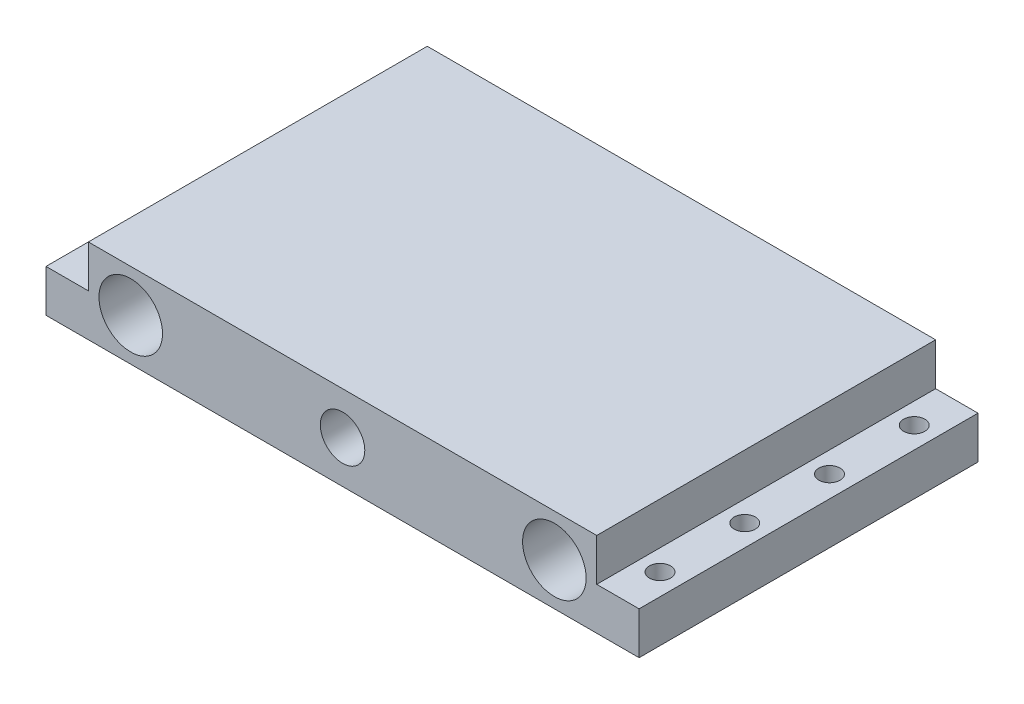
ISO-10303-21;
HEADER;
FILE_DESCRIPTION(('STEP AP214'),'2;1');
FILE_NAME('part.step','',(''),(''),'','','');
FILE_SCHEMA(('AUTOMOTIVE_DESIGN { 1 0 10303 214 1 1 1 1 }'));
ENDSEC;
DATA;
#1=APPLICATION_CONTEXT('core data for automotive mechanical design processes');
#2=APPLICATION_PROTOCOL_DEFINITION('international standard','automotive_design',2000,#1);
#3=PRODUCT_CONTEXT('',#1,'mechanical');
#4=PRODUCT('Part','Part','',(#3));
#5=PRODUCT_RELATED_PRODUCT_CATEGORY('part','',(#4));
#6=PRODUCT_DEFINITION_FORMATION('','',#4);
#7=PRODUCT_DEFINITION_CONTEXT('part definition',#1,'design');
#8=PRODUCT_DEFINITION('design','',#6,#7);
#9=PRODUCT_DEFINITION_SHAPE('','',#8);
#10=(LENGTH_UNIT() NAMED_UNIT(*) SI_UNIT(.MILLI.,.METRE.));
#11=(NAMED_UNIT(*) PLANE_ANGLE_UNIT() SI_UNIT($,.RADIAN.));
#12=(NAMED_UNIT(*) SI_UNIT($,.STERADIAN.) SOLID_ANGLE_UNIT());
#13=UNCERTAINTY_MEASURE_WITH_UNIT(LENGTH_MEASURE(1.E-05),#10,'distance_accuracy_value','');
#14=(GEOMETRIC_REPRESENTATION_CONTEXT(3) GLOBAL_UNCERTAINTY_ASSIGNED_CONTEXT((#13)) GLOBAL_UNIT_ASSIGNED_CONTEXT((#10,
#11,#12)) REPRESENTATION_CONTEXT('',''));
#15=CARTESIAN_POINT('',(0.,0.,0.));
#16=DIRECTION('',(0.,0.,1.));
#17=DIRECTION('',(1.,0.,0.));
#18=AXIS2_PLACEMENT_3D('',#15,#16,#17);
#19=CARTESIAN_POINT('',(0.,0.,80.));
#20=DIRECTION('',(1.,0.,0.));
#21=DIRECTION('',(0.,1.,0.));
#22=AXIS2_PLACEMENT_3D('',#19,#20,#21);
#23=PLANE('',#22);
#24=DIRECTION('',(0.,0.,1.));
#25=VECTOR('',#24,1.);
#26=CARTESIAN_POINT('',(0.,-10.,0.));
#27=LINE('',#26,#25);
#28=CARTESIAN_POINT('',(0.,-10.,0.));
#29=VERTEX_POINT('',#28);
#30=CARTESIAN_POINT('',(0.,-10.,80.));
#31=VERTEX_POINT('',#30);
#32=EDGE_CURVE('E124',#29,#31,#27,.T.);
#33=ORIENTED_EDGE('',*,*,#32,.F.);
#34=DIRECTION('',(0.,-1.,0.));
#35=VECTOR('',#34,1.);
#36=CARTESIAN_POINT('',(0.,0.,0.));
#37=LINE('',#36,#35);
#38=CARTESIAN_POINT('',(0.,-20.,0.));
#39=VERTEX_POINT('',#38);
#40=EDGE_CURVE('E119',#29,#39,#37,.T.);
#41=ORIENTED_EDGE('',*,*,#40,.T.);
#42=DIRECTION('',(0.,0.,-1.));
#43=VECTOR('',#42,1.);
#44=CARTESIAN_POINT('',(0.,-20.,80.));
#45=LINE('',#44,#43);
#46=CARTESIAN_POINT('',(0.,-20.,80.));
#47=VERTEX_POINT('',#46);
#48=EDGE_CURVE('E11',#47,#39,#45,.T.);
#49=ORIENTED_EDGE('',*,*,#48,.F.);
#50=DIRECTION('',(0.,-1.,0.));
#51=VECTOR('',#50,1.);
#52=CARTESIAN_POINT('',(0.,0.,80.));
#53=LINE('',#52,#51);
#54=EDGE_CURVE('E139',#31,#47,#53,.T.);
#55=ORIENTED_EDGE('',*,*,#54,.F.);
#56=EDGE_LOOP('',(#33,#41,#49,#55));
#57=FACE_BOUND('',#56,.T.);
#58=ADVANCED_FACE('F33',(#57),#23,.F.);
#59=CARTESIAN_POINT('',(0.,-20.,80.));
#60=DIRECTION('',(0.,1.,0.));
#61=DIRECTION('',(0.,0.,1.));
#62=AXIS2_PLACEMENT_3D('',#59,#60,#61);
#63=PLANE('',#62);
#64=CARTESIAN_POINT('',(5.05628695698741,-20.,30.));
#65=DIRECTION('',(0.,1.,0.));
#66=DIRECTION('',(0.,0.,1.));
#67=AXIS2_PLACEMENT_3D('',#64,#65,#66);
#68=CIRCLE('',#67,2.5);
#69=CARTESIAN_POINT('',(5.05628695698741,-20.,32.5));
#70=VERTEX_POINT('',#69);
#71=EDGE_CURVE('E186',#70,#70,#68,.T.);
#72=ORIENTED_EDGE('',*,*,#71,.T.);
#73=EDGE_LOOP('',(#72));
#74=FACE_BOUND('',#73,.T.);
#75=CARTESIAN_POINT('',(5.05628695698741,-20.,50.));
#76=DIRECTION('',(0.,1.,0.));
#77=DIRECTION('',(0.,0.,1.));
#78=AXIS2_PLACEMENT_3D('',#75,#76,#77);
#79=CIRCLE('',#78,2.5);
#80=CARTESIAN_POINT('',(5.05628695698741,-20.,52.5));
#81=VERTEX_POINT('',#80);
#82=EDGE_CURVE('E202',#81,#81,#79,.T.);
#83=ORIENTED_EDGE('',*,*,#82,.T.);
#84=EDGE_LOOP('',(#83));
#85=FACE_BOUND('',#84,.T.);
#86=CARTESIAN_POINT('',(5.05628695698741,-20.,70.));
#87=DIRECTION('',(0.,1.,0.));
#88=DIRECTION('',(0.,0.,1.));
#89=AXIS2_PLACEMENT_3D('',#86,#87,#88);
#90=CIRCLE('',#89,2.5);
#91=CARTESIAN_POINT('',(5.05628695698741,-20.,72.5));
#92=VERTEX_POINT('',#91);
#93=EDGE_CURVE('E205',#92,#92,#90,.T.);
#94=ORIENTED_EDGE('',*,*,#93,.T.);
#95=EDGE_LOOP('',(#94));
#96=FACE_BOUND('',#95,.T.);
#97=CARTESIAN_POINT('',(134.943713043013,-20.,70.));
#98=DIRECTION('',(0.,1.,0.));
#99=DIRECTION('',(0.,0.,1.));
#100=AXIS2_PLACEMENT_3D('',#97,#98,#99);
#101=CIRCLE('',#100,2.49999999999997);
#102=CARTESIAN_POINT('',(134.943713043013,-20.,72.5));
#103=VERTEX_POINT('',#102);
#104=EDGE_CURVE('E211',#103,#103,#101,.T.);
#105=ORIENTED_EDGE('',*,*,#104,.T.);
#106=EDGE_LOOP('',(#105));
#107=FACE_BOUND('',#106,.T.);
#108=CARTESIAN_POINT('',(134.943713043013,-20.,50.));
#109=DIRECTION('',(0.,1.,0.));
#110=DIRECTION('',(0.,0.,1.));
#111=AXIS2_PLACEMENT_3D('',#108,#109,#110);
#112=CIRCLE('',#111,2.49999999999997);
#113=CARTESIAN_POINT('',(134.943713043013,-20.,52.5));
#114=VERTEX_POINT('',#113);
#115=EDGE_CURVE('E214',#114,#114,#112,.T.);
#116=ORIENTED_EDGE('',*,*,#115,.T.);
#117=EDGE_LOOP('',(#116));
#118=FACE_BOUND('',#117,.T.);
#119=CARTESIAN_POINT('',(134.943713043013,-20.,30.));
#120=DIRECTION('',(0.,1.,0.));
#121=DIRECTION('',(0.,0.,1.));
#122=AXIS2_PLACEMENT_3D('',#119,#120,#121);
#123=CIRCLE('',#122,2.49999999999999);
#124=CARTESIAN_POINT('',(134.943713043013,-20.,32.5));
#125=VERTEX_POINT('',#124);
#126=EDGE_CURVE('E217',#125,#125,#123,.T.);
#127=ORIENTED_EDGE('',*,*,#126,.T.);
#128=EDGE_LOOP('',(#127));
#129=FACE_BOUND('',#128,.T.);
#130=CARTESIAN_POINT('',(134.943713043013,-20.,10.));
#131=DIRECTION('',(0.,1.,0.));
#132=DIRECTION('',(0.,0.,1.));
#133=AXIS2_PLACEMENT_3D('',#130,#131,#132);
#134=CIRCLE('',#133,2.5);
#135=CARTESIAN_POINT('',(134.943713043013,-20.,12.5));
#136=VERTEX_POINT('',#135);
#137=EDGE_CURVE('E220',#136,#136,#134,.T.);
#138=ORIENTED_EDGE('',*,*,#137,.T.);
#139=EDGE_LOOP('',(#138));
#140=FACE_BOUND('',#139,.T.);
#141=CARTESIAN_POINT('',(5.05628695698741,-20.,10.));
#142=DIRECTION('',(0.,1.,0.));
#143=DIRECTION('',(0.,0.,1.));
#144=AXIS2_PLACEMENT_3D('',#141,#142,#143);
#145=CIRCLE('',#144,2.5);
#146=CARTESIAN_POINT('',(5.05628695698741,-20.,12.5));
#147=VERTEX_POINT('',#146);
#148=EDGE_CURVE('E208',#147,#147,#145,.T.);
#149=ORIENTED_EDGE('',*,*,#148,.T.);
#150=EDGE_LOOP('',(#149));
#151=FACE_BOUND('',#150,.T.);
#152=DIRECTION('',(1.,0.,0.));
#153=VECTOR('',#152,1.);
#154=CARTESIAN_POINT('',(0.,-20.,0.));
#155=LINE('',#154,#153);
#156=CARTESIAN_POINT('',(140.,-20.,0.));
#157=VERTEX_POINT('',#156);
#158=EDGE_CURVE('E150',#39,#157,#155,.T.);
#159=ORIENTED_EDGE('',*,*,#158,.T.);
#160=DIRECTION('',(0.,0.,-1.));
#161=VECTOR('',#160,1.);
#162=CARTESIAN_POINT('',(140.,-20.,80.));
#163=LINE('',#162,#161);
#164=CARTESIAN_POINT('',(140.,-20.,80.));
#165=VERTEX_POINT('',#164);
#166=EDGE_CURVE('E40',#165,#157,#163,.T.);
#167=ORIENTED_EDGE('',*,*,#166,.F.);
#168=DIRECTION('',(1.,0.,0.));
#169=VECTOR('',#168,1.);
#170=CARTESIAN_POINT('',(0.,-20.,80.));
#171=LINE('',#170,#169);
#172=EDGE_CURVE('E141',#47,#165,#171,.T.);
#173=ORIENTED_EDGE('',*,*,#172,.F.);
#174=ORIENTED_EDGE('',*,*,#48,.T.);
#175=EDGE_LOOP('',(#159,#167,#173,#174));
#176=FACE_BOUND('',#175,.T.);
#177=ADVANCED_FACE('F165',(#74,#85,#96,#107,#118,#129,#140,#151,#176),#63,.F.);
#178=CARTESIAN_POINT('',(140.,0.,80.));
#179=DIRECTION('',(-1.,0.,0.));
#180=DIRECTION('',(0.,-1.,0.));
#181=AXIS2_PLACEMENT_3D('',#178,#179,#180);
#182=PLANE('',#181);
#183=DIRECTION('',(0.,1.,0.));
#184=VECTOR('',#183,1.);
#185=CARTESIAN_POINT('',(140.,0.,0.));
#186=LINE('',#185,#184);
#187=CARTESIAN_POINT('',(140.,-10.,0.));
#188=VERTEX_POINT('',#187);
#189=EDGE_CURVE('E152',#157,#188,#186,.T.);
#190=ORIENTED_EDGE('',*,*,#189,.T.);
#191=DIRECTION('',(0.,0.,-1.));
#192=VECTOR('',#191,1.);
#193=CARTESIAN_POINT('',(140.,-10.,0.));
#194=LINE('',#193,#192);
#195=CARTESIAN_POINT('',(140.,-10.,80.));
#196=VERTEX_POINT('',#195);
#197=EDGE_CURVE('E55',#196,#188,#194,.T.);
#198=ORIENTED_EDGE('',*,*,#197,.F.);
#199=DIRECTION('',(0.,1.,0.));
#200=VECTOR('',#199,1.);
#201=CARTESIAN_POINT('',(140.,0.,80.));
#202=LINE('',#201,#200);
#203=EDGE_CURVE('E143',#165,#196,#202,.T.);
#204=ORIENTED_EDGE('',*,*,#203,.F.);
#205=ORIENTED_EDGE('',*,*,#166,.T.);
#206=EDGE_LOOP('',(#190,#198,#204,#205));
#207=FACE_BOUND('',#206,.T.);
#208=ADVANCED_FACE('F158',(#207),#182,.F.);
#209=CARTESIAN_POINT('',(0.,0.,80.));
#210=DIRECTION('',(0.,-1.,0.));
#211=DIRECTION('',(0.,0.,-1.));
#212=AXIS2_PLACEMENT_3D('',#209,#210,#211);
#213=PLANE('',#212);
#214=DIRECTION('',(-1.,0.,0.));
#215=VECTOR('',#214,1.);
#216=CARTESIAN_POINT('',(0.,0.,80.));
#217=LINE('',#216,#215);
#218=CARTESIAN_POINT('',(130.,0.,80.));
#219=VERTEX_POINT('',#218);
#220=CARTESIAN_POINT('',(10.,0.,80.));
#221=VERTEX_POINT('',#220);
#222=EDGE_CURVE('E146',#219,#221,#217,.T.);
#223=ORIENTED_EDGE('',*,*,#222,.F.);
#224=DIRECTION('',(0.,0.,1.));
#225=VECTOR('',#224,1.);
#226=CARTESIAN_POINT('',(130.,0.,0.));
#227=LINE('',#226,#225);
#228=CARTESIAN_POINT('',(130.,0.,0.));
#229=VERTEX_POINT('',#228);
#230=EDGE_CURVE('E137',#229,#219,#227,.T.);
#231=ORIENTED_EDGE('',*,*,#230,.F.);
#232=DIRECTION('',(-1.,0.,0.));
#233=VECTOR('',#232,1.);
#234=CARTESIAN_POINT('',(0.,0.,0.));
#235=LINE('',#234,#233);
#236=CARTESIAN_POINT('',(10.,0.,0.));
#237=VERTEX_POINT('',#236);
#238=EDGE_CURVE('E117',#229,#237,#235,.T.);
#239=ORIENTED_EDGE('',*,*,#238,.T.);
#240=DIRECTION('',(0.,0.,-1.));
#241=VECTOR('',#240,1.);
#242=CARTESIAN_POINT('',(10.,0.,0.));
#243=LINE('',#242,#241);
#244=EDGE_CURVE('E127',#221,#237,#243,.T.);
#245=ORIENTED_EDGE('',*,*,#244,.F.);
#246=EDGE_LOOP('',(#223,#231,#239,#245));
#247=FACE_BOUND('',#246,.T.);
#248=ADVANCED_FACE('F179',(#247),#213,.F.);
#249=CARTESIAN_POINT('',(0.,0.,80.));
#250=DIRECTION('',(0.,0.,1.));
#251=DIRECTION('',(1.,0.,0.));
#252=AXIS2_PLACEMENT_3D('',#249,#250,#251);
#253=PLANE('',#252);
#254=CARTESIAN_POINT('',(20.,-10.,80.));
#255=DIRECTION('',(0.,0.,1.));
#256=DIRECTION('',(1.,0.,0.));
#257=AXIS2_PLACEMENT_3D('',#254,#255,#256);
#258=CIRCLE('',#257,7.5);
#259=CARTESIAN_POINT('',(27.5,-10.,80.));
#260=VERTEX_POINT('',#259);
#261=EDGE_CURVE('E195',#260,#260,#258,.T.);
#262=ORIENTED_EDGE('',*,*,#261,.F.);
#263=EDGE_LOOP('',(#262));
#264=FACE_BOUND('',#263,.T.);
#265=CARTESIAN_POINT('',(70.,-10.,80.));
#266=DIRECTION('',(0.,0.,1.));
#267=DIRECTION('',(1.,0.,0.));
#268=AXIS2_PLACEMENT_3D('',#265,#266,#267);
#269=CIRCLE('',#268,5.24999999999999);
#270=CARTESIAN_POINT('',(75.25,-10.,80.));
#271=VERTEX_POINT('',#270);
#272=EDGE_CURVE('E189',#271,#271,#269,.T.);
#273=ORIENTED_EDGE('',*,*,#272,.F.);
#274=EDGE_LOOP('',(#273));
#275=FACE_BOUND('',#274,.T.);
#276=CARTESIAN_POINT('',(120.,-10.,80.));
#277=DIRECTION('',(0.,0.,1.));
#278=DIRECTION('',(1.,0.,0.));
#279=AXIS2_PLACEMENT_3D('',#276,#277,#278);
#280=CIRCLE('',#279,7.50000000000003);
#281=CARTESIAN_POINT('',(127.5,-10.,80.));
#282=VERTEX_POINT('',#281);
#283=EDGE_CURVE('E182',#282,#282,#280,.T.);
#284=ORIENTED_EDGE('',*,*,#283,.F.);
#285=EDGE_LOOP('',(#284));
#286=FACE_BOUND('',#285,.T.);
#287=DIRECTION('',(0.,1.,0.));
#288=VECTOR('',#287,1.);
#289=CARTESIAN_POINT('',(130.,-10.,80.));
#290=LINE('',#289,#288);
#291=CARTESIAN_POINT('',(130.,-10.,80.));
#292=VERTEX_POINT('',#291);
#293=EDGE_CURVE('E103',#292,#219,#290,.T.);
#294=ORIENTED_EDGE('',*,*,#293,.T.);
#295=ORIENTED_EDGE('',*,*,#222,.T.);
#296=DIRECTION('',(0.,1.,0.));
#297=VECTOR('',#296,1.);
#298=CARTESIAN_POINT('',(10.,-10.,80.));
#299=LINE('',#298,#297);
#300=CARTESIAN_POINT('',(10.,-10.,80.));
#301=VERTEX_POINT('',#300);
#302=EDGE_CURVE('E132',#301,#221,#299,.T.);
#303=ORIENTED_EDGE('',*,*,#302,.F.);
#304=DIRECTION('',(1.,0.,0.));
#305=VECTOR('',#304,1.);
#306=CARTESIAN_POINT('',(0.,-10.,80.));
#307=LINE('',#306,#305);
#308=EDGE_CURVE('E126',#31,#301,#307,.T.);
#309=ORIENTED_EDGE('',*,*,#308,.F.);
#310=ORIENTED_EDGE('',*,*,#54,.T.);
#311=ORIENTED_EDGE('',*,*,#172,.T.);
#312=ORIENTED_EDGE('',*,*,#203,.T.);
#313=DIRECTION('',(1.,0.,0.));
#314=VECTOR('',#313,1.);
#315=CARTESIAN_POINT('',(140.,-10.,80.));
#316=LINE('',#315,#314);
#317=EDGE_CURVE('E105',#292,#196,#316,.T.);
#318=ORIENTED_EDGE('',*,*,#317,.F.);
#319=EDGE_LOOP('',(#294,#295,#303,#309,#310,#311,#312,#318));
#320=FACE_BOUND('',#319,.T.);
#321=ADVANCED_FACE('F173',(#264,#275,#286,#320),#253,.T.);
#322=CARTESIAN_POINT('',(0.,0.,0.));
#323=DIRECTION('',(0.,0.,1.));
#324=DIRECTION('',(1.,0.,0.));
#325=AXIS2_PLACEMENT_3D('',#322,#323,#324);
#326=PLANE('',#325);
#327=CARTESIAN_POINT('',(20.,-10.,0.));
#328=DIRECTION('',(0.,0.,1.));
#329=DIRECTION('',(1.,0.,0.));
#330=AXIS2_PLACEMENT_3D('',#327,#328,#329);
#331=CIRCLE('',#330,7.5);
#332=CARTESIAN_POINT('',(27.5,-10.,0.));
#333=VERTEX_POINT('',#332);
#334=EDGE_CURVE('E134',#333,#333,#331,.T.);
#335=ORIENTED_EDGE('',*,*,#334,.T.);
#336=EDGE_LOOP('',(#335));
#337=FACE_BOUND('',#336,.T.);
#338=CARTESIAN_POINT('',(70.,-10.,0.));
#339=DIRECTION('',(0.,0.,1.));
#340=DIRECTION('',(1.,0.,0.));
#341=AXIS2_PLACEMENT_3D('',#338,#339,#340);
#342=CIRCLE('',#341,5.24999999999999);
#343=CARTESIAN_POINT('',(75.25,-10.,0.));
#344=VERTEX_POINT('',#343);
#345=EDGE_CURVE('E192',#344,#344,#342,.T.);
#346=ORIENTED_EDGE('',*,*,#345,.T.);
#347=EDGE_LOOP('',(#346));
#348=FACE_BOUND('',#347,.T.);
#349=CARTESIAN_POINT('',(120.,-10.,0.));
#350=DIRECTION('',(0.,0.,1.));
#351=DIRECTION('',(1.,0.,0.));
#352=AXIS2_PLACEMENT_3D('',#349,#350,#351);
#353=CIRCLE('',#352,7.50000000000003);
#354=CARTESIAN_POINT('',(127.5,-10.,0.));
#355=VERTEX_POINT('',#354);
#356=EDGE_CURVE('E185',#355,#355,#353,.T.);
#357=ORIENTED_EDGE('',*,*,#356,.T.);
#358=EDGE_LOOP('',(#357));
#359=FACE_BOUND('',#358,.T.);
#360=ORIENTED_EDGE('',*,*,#238,.F.);
#361=DIRECTION('',(0.,1.,0.));
#362=VECTOR('',#361,1.);
#363=CARTESIAN_POINT('',(130.,-10.,0.));
#364=LINE('',#363,#362);
#365=CARTESIAN_POINT('',(130.,-10.,0.));
#366=VERTEX_POINT('',#365);
#367=EDGE_CURVE('E100',#366,#229,#364,.T.);
#368=ORIENTED_EDGE('',*,*,#367,.F.);
#369=DIRECTION('',(-1.,0.,0.));
#370=VECTOR('',#369,1.);
#371=CARTESIAN_POINT('',(140.,-10.,0.));
#372=LINE('',#371,#370);
#373=EDGE_CURVE('E106',#188,#366,#372,.T.);
#374=ORIENTED_EDGE('',*,*,#373,.F.);
#375=ORIENTED_EDGE('',*,*,#189,.F.);
#376=ORIENTED_EDGE('',*,*,#158,.F.);
#377=ORIENTED_EDGE('',*,*,#40,.F.);
#378=DIRECTION('',(-1.,0.,0.));
#379=VECTOR('',#378,1.);
#380=CARTESIAN_POINT('',(0.,-10.,0.));
#381=LINE('',#380,#379);
#382=CARTESIAN_POINT('',(10.,-10.,0.));
#383=VERTEX_POINT('',#382);
#384=EDGE_CURVE('E130',#383,#29,#381,.T.);
#385=ORIENTED_EDGE('',*,*,#384,.F.);
#386=DIRECTION('',(0.,1.,0.));
#387=VECTOR('',#386,1.);
#388=CARTESIAN_POINT('',(10.,-10.,0.));
#389=LINE('',#388,#387);
#390=EDGE_CURVE('E135',#383,#237,#389,.T.);
#391=ORIENTED_EDGE('',*,*,#390,.T.);
#392=EDGE_LOOP('',(#360,#368,#374,#375,#376,#377,#385,#391));
#393=FACE_BOUND('',#392,.T.);
#394=ADVANCED_FACE('F114',(#337,#348,#359,#393),#326,.F.);
#395=CARTESIAN_POINT('',(10.,-10.,0.));
#396=DIRECTION('',(1.,0.,0.));
#397=DIRECTION('',(0.,0.,-1.));
#398=AXIS2_PLACEMENT_3D('',#395,#396,#397);
#399=PLANE('',#398);
#400=ORIENTED_EDGE('',*,*,#244,.T.);
#401=ORIENTED_EDGE('',*,*,#390,.F.);
#402=DIRECTION('',(0.,0.,-1.));
#403=VECTOR('',#402,1.);
#404=CARTESIAN_POINT('',(10.,-10.,0.));
#405=LINE('',#404,#403);
#406=EDGE_CURVE('E47',#301,#383,#405,.T.);
#407=ORIENTED_EDGE('',*,*,#406,.F.);
#408=ORIENTED_EDGE('',*,*,#302,.T.);
#409=EDGE_LOOP('',(#400,#401,#407,#408));
#410=FACE_BOUND('',#409,.T.);
#411=ADVANCED_FACE('F177',(#410),#399,.F.);
#412=CARTESIAN_POINT('',(0.,-10.,0.));
#413=DIRECTION('',(0.,1.,0.));
#414=DIRECTION('',(0.,0.,1.));
#415=AXIS2_PLACEMENT_3D('',#412,#413,#414);
#416=PLANE('',#415);
#417=CARTESIAN_POINT('',(5.05628695698741,-10.,30.));
#418=DIRECTION('',(0.,1.,0.));
#419=DIRECTION('',(0.,0.,1.));
#420=AXIS2_PLACEMENT_3D('',#417,#418,#419);
#421=CIRCLE('',#420,2.5);
#422=CARTESIAN_POINT('',(5.05628695698741,-10.,32.5));
#423=VERTEX_POINT('',#422);
#424=EDGE_CURVE('E226',#423,#423,#421,.T.);
#425=ORIENTED_EDGE('',*,*,#424,.F.);
#426=EDGE_LOOP('',(#425));
#427=FACE_BOUND('',#426,.T.);
#428=CARTESIAN_POINT('',(5.05628695698741,-10.,50.));
#429=DIRECTION('',(0.,1.,0.));
#430=DIRECTION('',(0.,0.,1.));
#431=AXIS2_PLACEMENT_3D('',#428,#429,#430);
#432=CIRCLE('',#431,2.5);
#433=CARTESIAN_POINT('',(5.05628695698741,-10.,52.5));
#434=VERTEX_POINT('',#433);
#435=EDGE_CURVE('E234',#434,#434,#432,.T.);
#436=ORIENTED_EDGE('',*,*,#435,.F.);
#437=EDGE_LOOP('',(#436));
#438=FACE_BOUND('',#437,.T.);
#439=CARTESIAN_POINT('',(5.05628695698741,-10.,70.));
#440=DIRECTION('',(0.,1.,0.));
#441=DIRECTION('',(0.,0.,1.));
#442=AXIS2_PLACEMENT_3D('',#439,#440,#441);
#443=CIRCLE('',#442,2.5);
#444=CARTESIAN_POINT('',(5.05628695698741,-10.,72.5));
#445=VERTEX_POINT('',#444);
#446=EDGE_CURVE('E230',#445,#445,#443,.T.);
#447=ORIENTED_EDGE('',*,*,#446,.F.);
#448=EDGE_LOOP('',(#447));
#449=FACE_BOUND('',#448,.T.);
#450=CARTESIAN_POINT('',(5.05628695698741,-10.,10.));
#451=DIRECTION('',(0.,1.,0.));
#452=DIRECTION('',(0.,0.,1.));
#453=AXIS2_PLACEMENT_3D('',#450,#451,#452);
#454=CIRCLE('',#453,2.5);
#455=CARTESIAN_POINT('',(5.05628695698741,-10.,12.5));
#456=VERTEX_POINT('',#455);
#457=EDGE_CURVE('E223',#456,#456,#454,.T.);
#458=ORIENTED_EDGE('',*,*,#457,.F.);
#459=EDGE_LOOP('',(#458));
#460=FACE_BOUND('',#459,.T.);
#461=ORIENTED_EDGE('',*,*,#32,.T.);
#462=ORIENTED_EDGE('',*,*,#308,.T.);
#463=ORIENTED_EDGE('',*,*,#406,.T.);
#464=ORIENTED_EDGE('',*,*,#384,.T.);
#465=EDGE_LOOP('',(#461,#462,#463,#464));
#466=FACE_BOUND('',#465,.T.);
#467=ADVANCED_FACE('F170',(#427,#438,#449,#460,#466),#416,.T.);
#468=CARTESIAN_POINT('',(130.,-10.,0.));
#469=DIRECTION('',(-1.,0.,0.));
#470=DIRECTION('',(0.,0.,1.));
#471=AXIS2_PLACEMENT_3D('',#468,#469,#470);
#472=PLANE('',#471);
#473=ORIENTED_EDGE('',*,*,#230,.T.);
#474=ORIENTED_EDGE('',*,*,#293,.F.);
#475=DIRECTION('',(0.,0.,1.));
#476=VECTOR('',#475,1.);
#477=CARTESIAN_POINT('',(130.,-10.,0.));
#478=LINE('',#477,#476);
#479=EDGE_CURVE('E97',#366,#292,#478,.T.);
#480=ORIENTED_EDGE('',*,*,#479,.F.);
#481=ORIENTED_EDGE('',*,*,#367,.T.);
#482=EDGE_LOOP('',(#473,#474,#480,#481));
#483=FACE_BOUND('',#482,.T.);
#484=ADVANCED_FACE('F98',(#483),#472,.F.);
#485=CARTESIAN_POINT('',(0.,-10.,0.));
#486=DIRECTION('',(0.,-1.,0.));
#487=DIRECTION('',(0.,0.,-1.));
#488=AXIS2_PLACEMENT_3D('',#485,#486,#487);
#489=PLANE('',#488);
#490=CARTESIAN_POINT('',(134.943713043013,-10.,70.));
#491=DIRECTION('',(0.,1.,0.));
#492=DIRECTION('',(0.,0.,-1.));
#493=AXIS2_PLACEMENT_3D('',#490,#491,#492);
#494=CIRCLE('',#493,2.49999999999997);
#495=CARTESIAN_POINT('',(134.943713043013,-10.,67.5));
#496=VERTEX_POINT('',#495);
#497=EDGE_CURVE('E227',#496,#496,#494,.T.);
#498=ORIENTED_EDGE('',*,*,#497,.F.);
#499=EDGE_LOOP('',(#498));
#500=FACE_BOUND('',#499,.T.);
#501=CARTESIAN_POINT('',(134.943713043013,-10.,50.));
#502=DIRECTION('',(0.,1.,0.));
#503=DIRECTION('',(0.,0.,-1.));
#504=AXIS2_PLACEMENT_3D('',#501,#502,#503);
#505=CIRCLE('',#504,2.49999999999997);
#506=CARTESIAN_POINT('',(134.943713043013,-10.,47.5000000000001));
#507=VERTEX_POINT('',#506);
#508=EDGE_CURVE('E231',#507,#507,#505,.T.);
#509=ORIENTED_EDGE('',*,*,#508,.F.);
#510=EDGE_LOOP('',(#509));
#511=FACE_BOUND('',#510,.T.);
#512=CARTESIAN_POINT('',(134.943713043013,-10.,30.));
#513=DIRECTION('',(0.,1.,0.));
#514=DIRECTION('',(0.,0.,-1.));
#515=AXIS2_PLACEMENT_3D('',#512,#513,#514);
#516=CIRCLE('',#515,2.49999999999999);
#517=CARTESIAN_POINT('',(134.943713043013,-10.,27.5));
#518=VERTEX_POINT('',#517);
#519=EDGE_CURVE('E242',#518,#518,#516,.T.);
#520=ORIENTED_EDGE('',*,*,#519,.F.);
#521=EDGE_LOOP('',(#520));
#522=FACE_BOUND('',#521,.T.);
#523=CARTESIAN_POINT('',(134.943713043013,-10.,10.));
#524=DIRECTION('',(0.,1.,0.));
#525=DIRECTION('',(0.,0.,-1.));
#526=AXIS2_PLACEMENT_3D('',#523,#524,#525);
#527=CIRCLE('',#526,2.5);
#528=CARTESIAN_POINT('',(134.943713043013,-10.,7.50000000000003));
#529=VERTEX_POINT('',#528);
#530=EDGE_CURVE('E239',#529,#529,#527,.T.);
#531=ORIENTED_EDGE('',*,*,#530,.F.);
#532=EDGE_LOOP('',(#531));
#533=FACE_BOUND('',#532,.T.);
#534=ORIENTED_EDGE('',*,*,#197,.T.);
#535=ORIENTED_EDGE('',*,*,#373,.T.);
#536=ORIENTED_EDGE('',*,*,#479,.T.);
#537=ORIENTED_EDGE('',*,*,#317,.T.);
#538=EDGE_LOOP('',(#534,#535,#536,#537));
#539=FACE_BOUND('',#538,.T.);
#540=ADVANCED_FACE('F108',(#500,#511,#522,#533,#539),#489,.F.);
#541=CARTESIAN_POINT('',(120.,-10.,0.));
#542=DIRECTION('',(0.,0.,1.));
#543=DIRECTION('',(1.,0.,0.));
#544=AXIS2_PLACEMENT_3D('',#541,#542,#543);
#545=CYLINDRICAL_SURFACE('',#544,7.50000000000003);
#546=ORIENTED_EDGE('',*,*,#356,.F.);
#547=EDGE_LOOP('',(#546));
#548=FACE_BOUND('',#547,.T.);
#549=ORIENTED_EDGE('',*,*,#283,.T.);
#550=EDGE_LOOP('',(#549));
#551=FACE_BOUND('',#550,.T.);
#552=ADVANCED_FACE('F253',(#548,#551),#545,.F.);
#553=CARTESIAN_POINT('',(70.,-10.,0.));
#554=DIRECTION('',(0.,0.,1.));
#555=DIRECTION('',(1.,0.,0.));
#556=AXIS2_PLACEMENT_3D('',#553,#554,#555);
#557=CYLINDRICAL_SURFACE('',#556,5.24999999999999);
#558=ORIENTED_EDGE('',*,*,#345,.F.);
#559=EDGE_LOOP('',(#558));
#560=FACE_BOUND('',#559,.T.);
#561=ORIENTED_EDGE('',*,*,#272,.T.);
#562=EDGE_LOOP('',(#561));
#563=FACE_BOUND('',#562,.T.);
#564=ADVANCED_FACE('F353',(#560,#563),#557,.F.);
#565=CARTESIAN_POINT('',(20.,-10.,0.));
#566=DIRECTION('',(0.,0.,1.));
#567=DIRECTION('',(1.,0.,0.));
#568=AXIS2_PLACEMENT_3D('',#565,#566,#567);
#569=CYLINDRICAL_SURFACE('',#568,7.5);
#570=ORIENTED_EDGE('',*,*,#334,.F.);
#571=EDGE_LOOP('',(#570));
#572=FACE_BOUND('',#571,.T.);
#573=ORIENTED_EDGE('',*,*,#261,.T.);
#574=EDGE_LOOP('',(#573));
#575=FACE_BOUND('',#574,.T.);
#576=ADVANCED_FACE('F264',(#572,#575),#569,.F.);
#577=CARTESIAN_POINT('',(134.943713043013,-450.,10.));
#578=DIRECTION('',(0.,1.,0.));
#579=DIRECTION('',(0.,0.,1.));
#580=AXIS2_PLACEMENT_3D('',#577,#578,#579);
#581=CYLINDRICAL_SURFACE('',#580,2.5);
#582=ORIENTED_EDGE('',*,*,#530,.T.);
#583=EDGE_LOOP('',(#582));
#584=FACE_BOUND('',#583,.T.);
#585=ORIENTED_EDGE('',*,*,#137,.F.);
#586=EDGE_LOOP('',(#585));
#587=FACE_BOUND('',#586,.T.);
#588=ADVANCED_FACE('F260',(#584,#587),#581,.F.);
#589=CARTESIAN_POINT('',(134.943713043013,-450.,30.));
#590=DIRECTION('',(0.,1.,0.));
#591=DIRECTION('',(0.,0.,1.));
#592=AXIS2_PLACEMENT_3D('',#589,#590,#591);
#593=CYLINDRICAL_SURFACE('',#592,2.49999999999999);
#594=ORIENTED_EDGE('',*,*,#519,.T.);
#595=EDGE_LOOP('',(#594));
#596=FACE_BOUND('',#595,.T.);
#597=ORIENTED_EDGE('',*,*,#126,.F.);
#598=EDGE_LOOP('',(#597));
#599=FACE_BOUND('',#598,.T.);
#600=ADVANCED_FACE('F263',(#596,#599),#593,.F.);
#601=CARTESIAN_POINT('',(134.943713043013,-450.,50.));
#602=DIRECTION('',(0.,1.,0.));
#603=DIRECTION('',(0.,0.,1.));
#604=AXIS2_PLACEMENT_3D('',#601,#602,#603);
#605=CYLINDRICAL_SURFACE('',#604,2.49999999999997);
#606=ORIENTED_EDGE('',*,*,#508,.T.);
#607=EDGE_LOOP('',(#606));
#608=FACE_BOUND('',#607,.T.);
#609=ORIENTED_EDGE('',*,*,#115,.F.);
#610=EDGE_LOOP('',(#609));
#611=FACE_BOUND('',#610,.T.);
#612=ADVANCED_FACE('F248',(#608,#611),#605,.F.);
#613=CARTESIAN_POINT('',(134.943713043013,-450.,70.));
#614=DIRECTION('',(0.,1.,0.));
#615=DIRECTION('',(0.,0.,1.));
#616=AXIS2_PLACEMENT_3D('',#613,#614,#615);
#617=CYLINDRICAL_SURFACE('',#616,2.49999999999997);
#618=ORIENTED_EDGE('',*,*,#497,.T.);
#619=EDGE_LOOP('',(#618));
#620=FACE_BOUND('',#619,.T.);
#621=ORIENTED_EDGE('',*,*,#104,.F.);
#622=EDGE_LOOP('',(#621));
#623=FACE_BOUND('',#622,.T.);
#624=ADVANCED_FACE('F276',(#620,#623),#617,.F.);
#625=CARTESIAN_POINT('',(5.05628695698741,-450.,10.));
#626=DIRECTION('',(0.,1.,0.));
#627=DIRECTION('',(0.,0.,1.));
#628=AXIS2_PLACEMENT_3D('',#625,#626,#627);
#629=CYLINDRICAL_SURFACE('',#628,2.5);
#630=ORIENTED_EDGE('',*,*,#457,.T.);
#631=EDGE_LOOP('',(#630));
#632=FACE_BOUND('',#631,.T.);
#633=ORIENTED_EDGE('',*,*,#148,.F.);
#634=EDGE_LOOP('',(#633));
#635=FACE_BOUND('',#634,.T.);
#636=ADVANCED_FACE('F273',(#632,#635),#629,.F.);
#637=CARTESIAN_POINT('',(5.05628695698741,-450.,70.));
#638=DIRECTION('',(0.,1.,0.));
#639=DIRECTION('',(0.,0.,1.));
#640=AXIS2_PLACEMENT_3D('',#637,#638,#639);
#641=CYLINDRICAL_SURFACE('',#640,2.5);
#642=ORIENTED_EDGE('',*,*,#446,.T.);
#643=EDGE_LOOP('',(#642));
#644=FACE_BOUND('',#643,.T.);
#645=ORIENTED_EDGE('',*,*,#93,.F.);
#646=EDGE_LOOP('',(#645));
#647=FACE_BOUND('',#646,.T.);
#648=ADVANCED_FACE('F275',(#644,#647),#641,.F.);
#649=CARTESIAN_POINT('',(5.05628695698741,-450.,50.));
#650=DIRECTION('',(0.,1.,0.));
#651=DIRECTION('',(0.,0.,1.));
#652=AXIS2_PLACEMENT_3D('',#649,#650,#651);
#653=CYLINDRICAL_SURFACE('',#652,2.5);
#654=ORIENTED_EDGE('',*,*,#435,.T.);
#655=EDGE_LOOP('',(#654));
#656=FACE_BOUND('',#655,.T.);
#657=ORIENTED_EDGE('',*,*,#82,.F.);
#658=EDGE_LOOP('',(#657));
#659=FACE_BOUND('',#658,.T.);
#660=ADVANCED_FACE('F283',(#656,#659),#653,.F.);
#661=CARTESIAN_POINT('',(5.05628695698741,-450.,30.));
#662=DIRECTION('',(0.,1.,0.));
#663=DIRECTION('',(0.,0.,1.));
#664=AXIS2_PLACEMENT_3D('',#661,#662,#663);
#665=CYLINDRICAL_SURFACE('',#664,2.5);
#666=ORIENTED_EDGE('',*,*,#424,.T.);
#667=EDGE_LOOP('',(#666));
#668=FACE_BOUND('',#667,.T.);
#669=ORIENTED_EDGE('',*,*,#71,.F.);
#670=EDGE_LOOP('',(#669));
#671=FACE_BOUND('',#670,.T.);
#672=ADVANCED_FACE('F406',(#668,#671),#665,.F.);
#673=CLOSED_SHELL('',(#58,#177,#208,#248,#321,#394,#411,#467,#484,#540,#552,#564,#576,#588,#600,
#612,#624,#636,#648,#660,#672));
#674=MANIFOLD_SOLID_BREP('B2',#673);
#675=ADVANCED_BREP_SHAPE_REPRESENTATION('',(#18,#674),#14);
#676=SHAPE_DEFINITION_REPRESENTATION(#9,#675);
ENDSEC;
END-ISO-10303-21;
